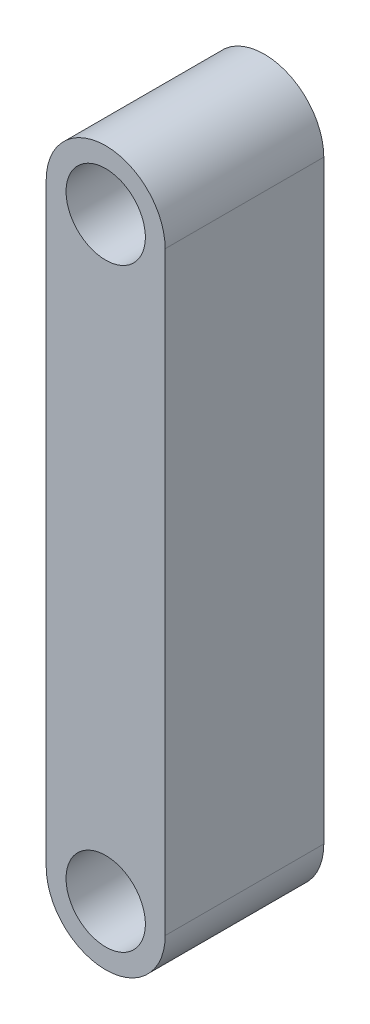
ISO-10303-21;
HEADER;
FILE_DESCRIPTION(('STEP AP214'),'2;1');
FILE_NAME('part.step','',(''),(''),'','','');
FILE_SCHEMA(('AUTOMOTIVE_DESIGN { 1 0 10303 214 1 1 1 1 }'));
ENDSEC;
DATA;
#1=APPLICATION_CONTEXT('core data for automotive mechanical design processes');
#2=APPLICATION_PROTOCOL_DEFINITION('international standard','automotive_design',2000,#1);
#3=PRODUCT_CONTEXT('',#1,'mechanical');
#4=PRODUCT('Part','Part','',(#3));
#5=PRODUCT_RELATED_PRODUCT_CATEGORY('part','',(#4));
#6=PRODUCT_DEFINITION_FORMATION('','',#4);
#7=PRODUCT_DEFINITION_CONTEXT('part definition',#1,'design');
#8=PRODUCT_DEFINITION('design','',#6,#7);
#9=PRODUCT_DEFINITION_SHAPE('','',#8);
#10=(LENGTH_UNIT() NAMED_UNIT(*) SI_UNIT(.MILLI.,.METRE.));
#11=(NAMED_UNIT(*) PLANE_ANGLE_UNIT() SI_UNIT($,.RADIAN.));
#12=(NAMED_UNIT(*) SI_UNIT($,.STERADIAN.) SOLID_ANGLE_UNIT());
#13=UNCERTAINTY_MEASURE_WITH_UNIT(LENGTH_MEASURE(1.E-05),#10,'distance_accuracy_value','');
#14=(GEOMETRIC_REPRESENTATION_CONTEXT(3) GLOBAL_UNCERTAINTY_ASSIGNED_CONTEXT((#13)) GLOBAL_UNIT_ASSIGNED_CONTEXT((#10,
#11,#12)) REPRESENTATION_CONTEXT('',''));
#15=CARTESIAN_POINT('',(0.,0.,0.));
#16=DIRECTION('',(0.,0.,1.));
#17=DIRECTION('',(1.,0.,0.));
#18=AXIS2_PLACEMENT_3D('',#15,#16,#17);
#19=CARTESIAN_POINT('',(0.,-15.,0.));
#20=DIRECTION('',(0.,0.,1.));
#21=DIRECTION('',(1.,0.,0.));
#22=AXIS2_PLACEMENT_3D('',#19,#20,#21);
#23=PLANE('',#22);
#24=CARTESIAN_POINT('',(0.,-15.,0.));
#25=DIRECTION('',(0.,0.,-1.));
#26=DIRECTION('',(-1.,0.,0.));
#27=AXIS2_PLACEMENT_3D('',#24,#25,#26);
#28=CIRCLE('',#27,1.99999999999999);
#29=CARTESIAN_POINT('',(-1.99999999999999,-15.,0.));
#30=VERTEX_POINT('',#29);
#31=EDGE_CURVE('E176',#30,#30,#28,.T.);
#32=ORIENTED_EDGE('',*,*,#31,.F.);
#33=EDGE_LOOP('',(#32));
#34=FACE_BOUND('',#33,.T.);
#35=DIRECTION('',(0.,-1.,0.));
#36=VECTOR('',#35,1.);
#37=CARTESIAN_POINT('',(3.,15.,0.));
#38=LINE('',#37,#36);
#39=CARTESIAN_POINT('',(3.,15.,0.));
#40=VERTEX_POINT('',#39);
#41=CARTESIAN_POINT('',(3.,-15.,0.));
#42=VERTEX_POINT('',#41);
#43=EDGE_CURVE('E118',#40,#42,#38,.T.);
#44=ORIENTED_EDGE('',*,*,#43,.T.);
#45=CARTESIAN_POINT('',(0.,-15.,0.));
#46=DIRECTION('',(0.,0.,1.));
#47=DIRECTION('',(1.,0.,0.));
#48=AXIS2_PLACEMENT_3D('',#45,#46,#47);
#49=CIRCLE('',#48,3.);
#50=CARTESIAN_POINT('',(-3.,-15.,0.));
#51=VERTEX_POINT('',#50);
#52=EDGE_CURVE('E122',#51,#42,#49,.T.);
#53=ORIENTED_EDGE('',*,*,#52,.F.);
#54=DIRECTION('',(0.,-1.,0.));
#55=VECTOR('',#54,1.);
#56=CARTESIAN_POINT('',(-3.,15.,0.));
#57=LINE('',#56,#55);
#58=CARTESIAN_POINT('',(-3.,15.,0.));
#59=VERTEX_POINT('',#58);
#60=EDGE_CURVE('E103',#59,#51,#57,.T.);
#61=ORIENTED_EDGE('',*,*,#60,.F.);
#62=CARTESIAN_POINT('',(0.,15.,0.));
#63=DIRECTION('',(0.,0.,1.));
#64=DIRECTION('',(1.,0.,0.));
#65=AXIS2_PLACEMENT_3D('',#62,#63,#64);
#66=CIRCLE('',#65,3.);
#67=EDGE_CURVE('E80',#40,#59,#66,.T.);
#68=ORIENTED_EDGE('',*,*,#67,.F.);
#69=EDGE_LOOP('',(#44,#53,#61,#68));
#70=FACE_BOUND('',#69,.T.);
#71=CARTESIAN_POINT('',(0.,15.,0.));
#72=DIRECTION('',(0.,0.,-1.));
#73=DIRECTION('',(-1.,0.,0.));
#74=AXIS2_PLACEMENT_3D('',#71,#72,#73);
#75=CIRCLE('',#74,1.99999999999999);
#76=CARTESIAN_POINT('',(-1.99999999999999,15.,0.));
#77=VERTEX_POINT('',#76);
#78=EDGE_CURVE('E169',#77,#77,#75,.T.);
#79=ORIENTED_EDGE('',*,*,#78,.F.);
#80=EDGE_LOOP('',(#79));
#81=FACE_BOUND('',#80,.T.);
#82=ADVANCED_FACE('F45',(#34,#70,#81),#23,.F.);
#83=CARTESIAN_POINT('',(3.,15.,8.));
#84=DIRECTION('',(1.,0.,0.));
#85=DIRECTION('',(0.,0.,-1.));
#86=AXIS2_PLACEMENT_3D('',#83,#84,#85);
#87=PLANE('',#86);
#88=ORIENTED_EDGE('',*,*,#43,.F.);
#89=DIRECTION('',(0.,0.,-1.));
#90=VECTOR('',#89,1.);
#91=CARTESIAN_POINT('',(3.,15.,8.));
#92=LINE('',#91,#90);
#93=CARTESIAN_POINT('',(3.,15.,8.));
#94=VERTEX_POINT('',#93);
#95=EDGE_CURVE('E11',#94,#40,#92,.T.);
#96=ORIENTED_EDGE('',*,*,#95,.F.);
#97=DIRECTION('',(0.,-1.,0.));
#98=VECTOR('',#97,1.);
#99=CARTESIAN_POINT('',(3.,15.,8.));
#100=LINE('',#99,#98);
#101=CARTESIAN_POINT('',(3.,-15.,8.));
#102=VERTEX_POINT('',#101);
#103=EDGE_CURVE('E110',#94,#102,#100,.T.);
#104=ORIENTED_EDGE('',*,*,#103,.T.);
#105=DIRECTION('',(0.,0.,-1.));
#106=VECTOR('',#105,1.);
#107=CARTESIAN_POINT('',(3.,-15.,8.));
#108=LINE('',#107,#106);
#109=EDGE_CURVE('E49',#102,#42,#108,.T.);
#110=ORIENTED_EDGE('',*,*,#109,.T.);
#111=EDGE_LOOP('',(#88,#96,#104,#110));
#112=FACE_BOUND('',#111,.T.);
#113=ADVANCED_FACE('F47',(#112),#87,.T.);
#114=CARTESIAN_POINT('',(0.,15.,8.));
#115=DIRECTION('',(0.,0.,-1.));
#116=DIRECTION('',(-1.,0.,0.));
#117=AXIS2_PLACEMENT_3D('',#114,#115,#116);
#118=CYLINDRICAL_SURFACE('',#117,3.);
#119=ORIENTED_EDGE('',*,*,#67,.T.);
#120=DIRECTION('',(0.,0.,-1.));
#121=VECTOR('',#120,1.);
#122=CARTESIAN_POINT('',(-3.,15.,8.));
#123=LINE('',#122,#121);
#124=CARTESIAN_POINT('',(-3.,15.,8.));
#125=VERTEX_POINT('',#124);
#126=EDGE_CURVE('E56',#125,#59,#123,.T.);
#127=ORIENTED_EDGE('',*,*,#126,.F.);
#128=CARTESIAN_POINT('',(0.,15.,8.));
#129=DIRECTION('',(0.,0.,1.));
#130=DIRECTION('',(1.,0.,0.));
#131=AXIS2_PLACEMENT_3D('',#128,#129,#130);
#132=CIRCLE('',#131,3.);
#133=EDGE_CURVE('E95',#94,#125,#132,.T.);
#134=ORIENTED_EDGE('',*,*,#133,.F.);
#135=ORIENTED_EDGE('',*,*,#95,.T.);
#136=EDGE_LOOP('',(#119,#127,#134,#135));
#137=FACE_BOUND('',#136,.T.);
#138=ADVANCED_FACE('F135',(#137),#118,.T.);
#139=CARTESIAN_POINT('',(-3.,15.,8.));
#140=DIRECTION('',(1.,0.,0.));
#141=DIRECTION('',(0.,0.,-1.));
#142=AXIS2_PLACEMENT_3D('',#139,#140,#141);
#143=PLANE('',#142);
#144=ORIENTED_EDGE('',*,*,#60,.T.);
#145=DIRECTION('',(0.,0.,-1.));
#146=VECTOR('',#145,1.);
#147=CARTESIAN_POINT('',(-3.,-15.,8.));
#148=LINE('',#147,#146);
#149=CARTESIAN_POINT('',(-3.,-15.,8.));
#150=VERTEX_POINT('',#149);
#151=EDGE_CURVE('E100',#150,#51,#148,.T.);
#152=ORIENTED_EDGE('',*,*,#151,.F.);
#153=DIRECTION('',(0.,-1.,0.));
#154=VECTOR('',#153,1.);
#155=CARTESIAN_POINT('',(-3.,15.,8.));
#156=LINE('',#155,#154);
#157=EDGE_CURVE('E92',#125,#150,#156,.T.);
#158=ORIENTED_EDGE('',*,*,#157,.F.);
#159=ORIENTED_EDGE('',*,*,#126,.T.);
#160=EDGE_LOOP('',(#144,#152,#158,#159));
#161=FACE_BOUND('',#160,.T.);
#162=ADVANCED_FACE('F101',(#161),#143,.F.);
#163=CARTESIAN_POINT('',(0.,-15.,8.));
#164=DIRECTION('',(0.,0.,-1.));
#165=DIRECTION('',(-1.,0.,0.));
#166=AXIS2_PLACEMENT_3D('',#163,#164,#165);
#167=CYLINDRICAL_SURFACE('',#166,3.);
#168=ORIENTED_EDGE('',*,*,#52,.T.);
#169=ORIENTED_EDGE('',*,*,#109,.F.);
#170=CARTESIAN_POINT('',(0.,-15.,8.));
#171=DIRECTION('',(0.,0.,1.));
#172=DIRECTION('',(1.,0.,0.));
#173=AXIS2_PLACEMENT_3D('',#170,#171,#172);
#174=CIRCLE('',#173,3.);
#175=EDGE_CURVE('E89',#150,#102,#174,.T.);
#176=ORIENTED_EDGE('',*,*,#175,.F.);
#177=ORIENTED_EDGE('',*,*,#151,.T.);
#178=EDGE_LOOP('',(#168,#169,#176,#177));
#179=FACE_BOUND('',#178,.T.);
#180=ADVANCED_FACE('F108',(#179),#167,.T.);
#181=CARTESIAN_POINT('',(0.,-15.,8.));
#182=DIRECTION('',(0.,0.,1.));
#183=DIRECTION('',(1.,0.,0.));
#184=AXIS2_PLACEMENT_3D('',#181,#182,#183);
#185=PLANE('',#184);
#186=CARTESIAN_POINT('',(0.,-15.,8.));
#187=DIRECTION('',(0.,0.,-1.));
#188=DIRECTION('',(-1.,0.,0.));
#189=AXIS2_PLACEMENT_3D('',#186,#187,#188);
#190=CIRCLE('',#189,2.);
#191=CARTESIAN_POINT('',(-2.,-15.,8.));
#192=VERTEX_POINT('',#191);
#193=EDGE_CURVE('E165',#192,#192,#190,.T.);
#194=ORIENTED_EDGE('',*,*,#193,.T.);
#195=EDGE_LOOP('',(#194));
#196=FACE_BOUND('',#195,.T.);
#197=CARTESIAN_POINT('',(0.,15.,8.));
#198=DIRECTION('',(0.,0.,-1.));
#199=DIRECTION('',(-1.,0.,0.));
#200=AXIS2_PLACEMENT_3D('',#197,#198,#199);
#201=CIRCLE('',#200,2.);
#202=CARTESIAN_POINT('',(-2.,15.,8.));
#203=VERTEX_POINT('',#202);
#204=EDGE_CURVE('E123',#203,#203,#201,.T.);
#205=ORIENTED_EDGE('',*,*,#204,.T.);
#206=EDGE_LOOP('',(#205));
#207=FACE_BOUND('',#206,.T.);
#208=ORIENTED_EDGE('',*,*,#103,.F.);
#209=ORIENTED_EDGE('',*,*,#133,.T.);
#210=ORIENTED_EDGE('',*,*,#157,.T.);
#211=ORIENTED_EDGE('',*,*,#175,.T.);
#212=EDGE_LOOP('',(#208,#209,#210,#211));
#213=FACE_BOUND('',#212,.T.);
#214=ADVANCED_FACE('F94',(#196,#207,#213),#185,.T.);
#215=CARTESIAN_POINT('',(0.,15.,0.));
#216=DIRECTION('',(0.,0.,-1.));
#217=DIRECTION('',(-1.,0.,0.));
#218=AXIS2_PLACEMENT_3D('',#215,#216,#217);
#219=CYLINDRICAL_SURFACE('',#218,1.99999999999999);
#220=ORIENTED_EDGE('',*,*,#204,.F.);
#221=EDGE_LOOP('',(#220));
#222=FACE_BOUND('',#221,.T.);
#223=ORIENTED_EDGE('',*,*,#78,.T.);
#224=EDGE_LOOP('',(#223));
#225=FACE_BOUND('',#224,.T.);
#226=ADVANCED_FACE('F155',(#222,#225),#219,.F.);
#227=CARTESIAN_POINT('',(0.,-15.,0.));
#228=DIRECTION('',(0.,0.,-1.));
#229=DIRECTION('',(-1.,0.,0.));
#230=AXIS2_PLACEMENT_3D('',#227,#228,#229);
#231=CYLINDRICAL_SURFACE('',#230,1.99999999999999);
#232=ORIENTED_EDGE('',*,*,#193,.F.);
#233=EDGE_LOOP('',(#232));
#234=FACE_BOUND('',#233,.T.);
#235=ORIENTED_EDGE('',*,*,#31,.T.);
#236=EDGE_LOOP('',(#235));
#237=FACE_BOUND('',#236,.T.);
#238=ADVANCED_FACE('F160',(#234,#237),#231,.F.);
#239=CLOSED_SHELL('',(#82,#113,#138,#162,#180,#214,#226,#238));
#240=MANIFOLD_SOLID_BREP('B2',#239);
#241=ADVANCED_BREP_SHAPE_REPRESENTATION('',(#18,#240),#14);
#242=SHAPE_DEFINITION_REPRESENTATION(#9,#241);
ENDSEC;
END-ISO-10303-21;
